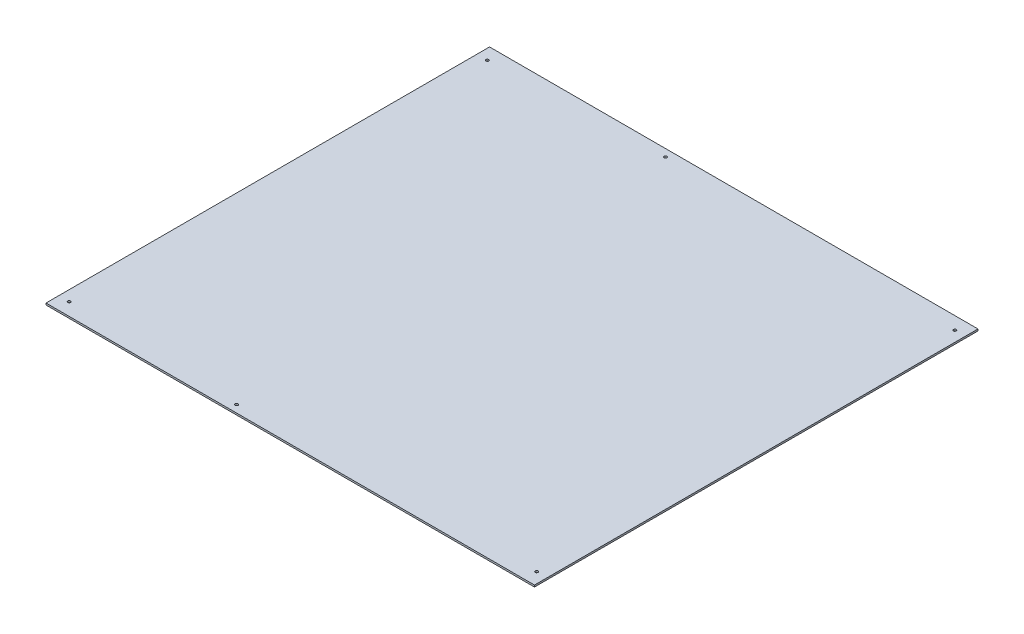
ISO-10303-21;
HEADER;
FILE_DESCRIPTION(('STEP AP214'),'2;1');
FILE_NAME('part.step','',(''),(''),'','','');
FILE_SCHEMA(('AUTOMOTIVE_DESIGN { 1 0 10303 214 1 1 1 1 }'));
ENDSEC;
DATA;
#1=APPLICATION_CONTEXT('core data for automotive mechanical design processes');
#2=APPLICATION_PROTOCOL_DEFINITION('international standard','automotive_design',2000,#1);
#3=PRODUCT_CONTEXT('',#1,'mechanical');
#4=PRODUCT('Part','Part','',(#3));
#5=PRODUCT_RELATED_PRODUCT_CATEGORY('part','',(#4));
#6=PRODUCT_DEFINITION_FORMATION('','',#4);
#7=PRODUCT_DEFINITION_CONTEXT('part definition',#1,'design');
#8=PRODUCT_DEFINITION('design','',#6,#7);
#9=PRODUCT_DEFINITION_SHAPE('','',#8);
#10=(LENGTH_UNIT() NAMED_UNIT(*) SI_UNIT(.MILLI.,.METRE.));
#11=(NAMED_UNIT(*) PLANE_ANGLE_UNIT() SI_UNIT($,.RADIAN.));
#12=(NAMED_UNIT(*) SI_UNIT($,.STERADIAN.) SOLID_ANGLE_UNIT());
#13=UNCERTAINTY_MEASURE_WITH_UNIT(LENGTH_MEASURE(1.E-05),#10,'distance_accuracy_value','');
#14=(GEOMETRIC_REPRESENTATION_CONTEXT(3) GLOBAL_UNCERTAINTY_ASSIGNED_CONTEXT((#13)) GLOBAL_UNIT_ASSIGNED_CONTEXT((#10,
#11,#12)) REPRESENTATION_CONTEXT('',''));
#15=CARTESIAN_POINT('',(0.,0.,0.));
#16=DIRECTION('',(0.,0.,1.));
#17=DIRECTION('',(1.,0.,0.));
#18=AXIS2_PLACEMENT_3D('',#15,#16,#17);
#19=CARTESIAN_POINT('',(0.,2.,0.));
#20=DIRECTION('',(0.,-1.,0.));
#21=DIRECTION('',(0.,0.,-1.));
#22=AXIS2_PLACEMENT_3D('',#19,#20,#21);
#23=PLANE('',#22);
#24=CARTESIAN_POINT('',(206.75,2.,-491.));
#25=DIRECTION('',(0.,1.,0.));
#26=DIRECTION('',(0.,0.,1.));
#27=AXIS2_PLACEMENT_3D('',#24,#25,#26);
#28=CIRCLE('',#27,1.59999999999996);
#29=CARTESIAN_POINT('',(206.75,2.,-489.4));
#30=VERTEX_POINT('',#29);
#31=EDGE_CURVE('E154',#30,#30,#28,.T.);
#32=ORIENTED_EDGE('',*,*,#31,.F.);
#33=EDGE_LOOP('',(#32));
#34=FACE_BOUND('',#33,.T.);
#35=CARTESIAN_POINT('',(206.75,2.,-9.00000000000001));
#36=DIRECTION('',(0.,1.,0.));
#37=DIRECTION('',(0.,0.,1.));
#38=AXIS2_PLACEMENT_3D('',#35,#36,#37);
#39=CIRCLE('',#38,1.59999999999996);
#40=CARTESIAN_POINT('',(206.75,2.,-7.40000000000005));
#41=VERTEX_POINT('',#40);
#42=EDGE_CURVE('E155',#41,#41,#39,.T.);
#43=ORIENTED_EDGE('',*,*,#42,.F.);
#44=EDGE_LOOP('',(#43));
#45=FACE_BOUND('',#44,.T.);
#46=CARTESIAN_POINT('',(12.5,2.,-485.));
#47=DIRECTION('',(0.,1.,0.));
#48=DIRECTION('',(0.,0.,1.));
#49=AXIS2_PLACEMENT_3D('',#46,#47,#48);
#50=CIRCLE('',#49,1.55000000000003);
#51=CARTESIAN_POINT('',(12.5,2.,-483.45));
#52=VERTEX_POINT('',#51);
#53=EDGE_CURVE('E44',#52,#52,#50,.T.);
#54=ORIENTED_EDGE('',*,*,#53,.F.);
#55=EDGE_LOOP('',(#54));
#56=FACE_BOUND('',#55,.T.);
#57=CARTESIAN_POINT('',(538.,2.,-485.));
#58=DIRECTION('',(0.,1.,0.));
#59=DIRECTION('',(0.,0.,-1.));
#60=AXIS2_PLACEMENT_3D('',#57,#58,#59);
#61=CIRCLE('',#60,1.55);
#62=CARTESIAN_POINT('',(538.,2.,-486.55));
#63=VERTEX_POINT('',#62);
#64=EDGE_CURVE('E114',#63,#63,#61,.T.);
#65=ORIENTED_EDGE('',*,*,#64,.F.);
#66=EDGE_LOOP('',(#65));
#67=FACE_BOUND('',#66,.T.);
#68=CARTESIAN_POINT('',(538.,2.,-15.0000000000001));
#69=DIRECTION('',(0.,1.,0.));
#70=DIRECTION('',(0.,0.,1.));
#71=AXIS2_PLACEMENT_3D('',#68,#69,#70);
#72=CIRCLE('',#71,1.54999999999999);
#73=CARTESIAN_POINT('',(538.,2.,-13.4500000000001));
#74=VERTEX_POINT('',#73);
#75=EDGE_CURVE('E121',#74,#74,#72,.T.);
#76=ORIENTED_EDGE('',*,*,#75,.F.);
#77=EDGE_LOOP('',(#76));
#78=FACE_BOUND('',#77,.T.);
#79=CARTESIAN_POINT('',(12.5,2.,-15.));
#80=DIRECTION('',(0.,1.,0.));
#81=DIRECTION('',(0.,0.,-1.));
#82=AXIS2_PLACEMENT_3D('',#79,#80,#81);
#83=CIRCLE('',#82,1.55000000000002);
#84=CARTESIAN_POINT('',(12.5,2.,-16.55));
#85=VERTEX_POINT('',#84);
#86=EDGE_CURVE('E106',#85,#85,#83,.T.);
#87=ORIENTED_EDGE('',*,*,#86,.F.);
#88=EDGE_LOOP('',(#87));
#89=FACE_BOUND('',#88,.T.);
#90=DIRECTION('',(0.,0.,-1.));
#91=VECTOR('',#90,1.);
#92=CARTESIAN_POINT('',(549.75,2.,-0.750000000000034));
#93=LINE('',#92,#91);
#94=CARTESIAN_POINT('',(549.75,2.,-0.750000000000034));
#95=VERTEX_POINT('',#94);
#96=CARTESIAN_POINT('',(549.75,2.,-499.25));
#97=VERTEX_POINT('',#96);
#98=EDGE_CURVE('E79',#95,#97,#93,.T.);
#99=ORIENTED_EDGE('',*,*,#98,.T.);
#100=DIRECTION('',(-1.,0.,0.));
#101=VECTOR('',#100,1.);
#102=CARTESIAN_POINT('',(549.75,2.,-499.25));
#103=LINE('',#102,#101);
#104=CARTESIAN_POINT('',(0.75,2.,-499.25));
#105=VERTEX_POINT('',#104);
#106=EDGE_CURVE('E92',#97,#105,#103,.T.);
#107=ORIENTED_EDGE('',*,*,#106,.T.);
#108=DIRECTION('',(0.,0.,1.));
#109=VECTOR('',#108,1.);
#110=CARTESIAN_POINT('',(0.75,2.,-499.25));
#111=LINE('',#110,#109);
#112=CARTESIAN_POINT('',(0.750000000000061,2.,-0.75));
#113=VERTEX_POINT('',#112);
#114=EDGE_CURVE('E51',#105,#113,#111,.T.);
#115=ORIENTED_EDGE('',*,*,#114,.T.);
#116=DIRECTION('',(1.,0.,0.));
#117=VECTOR('',#116,1.);
#118=CARTESIAN_POINT('',(0.750000000000061,2.,-0.75));
#119=LINE('',#118,#117);
#120=EDGE_CURVE('E109',#113,#95,#119,.T.);
#121=ORIENTED_EDGE('',*,*,#120,.T.);
#122=EDGE_LOOP('',(#99,#107,#115,#121));
#123=FACE_BOUND('',#122,.T.);
#124=ADVANCED_FACE('F36',(#34,#45,#56,#67,#78,#89,#123),#23,.F.);
#125=CARTESIAN_POINT('',(0.,0.,0.));
#126=DIRECTION('',(0.,-1.,0.));
#127=DIRECTION('',(0.,0.,-1.));
#128=AXIS2_PLACEMENT_3D('',#125,#126,#127);
#129=PLANE('',#128);
#130=CARTESIAN_POINT('',(206.75,0.,-491.));
#131=DIRECTION('',(0.,-1.,0.));
#132=DIRECTION('',(0.,0.,-1.));
#133=AXIS2_PLACEMENT_3D('',#130,#131,#132);
#134=CIRCLE('',#133,1.59999999999996);
#135=CARTESIAN_POINT('',(206.75,0.,-492.6));
#136=VERTEX_POINT('',#135);
#137=EDGE_CURVE('E83',#136,#136,#134,.F.);
#138=ORIENTED_EDGE('',*,*,#137,.T.);
#139=EDGE_LOOP('',(#138));
#140=FACE_BOUND('',#139,.T.);
#141=CARTESIAN_POINT('',(206.75,0.,-9.00000000000001));
#142=DIRECTION('',(0.,-1.,0.));
#143=DIRECTION('',(0.,0.,-1.));
#144=AXIS2_PLACEMENT_3D('',#141,#142,#143);
#145=CIRCLE('',#144,1.59999999999996);
#146=CARTESIAN_POINT('',(206.75,0.,-10.6));
#147=VERTEX_POINT('',#146);
#148=EDGE_CURVE('E151',#147,#147,#145,.F.);
#149=ORIENTED_EDGE('',*,*,#148,.T.);
#150=EDGE_LOOP('',(#149));
#151=FACE_BOUND('',#150,.T.);
#152=CARTESIAN_POINT('',(12.5,0.,-485.));
#153=DIRECTION('',(0.,-1.,0.));
#154=DIRECTION('',(0.,0.,-1.));
#155=AXIS2_PLACEMENT_3D('',#152,#153,#154);
#156=CIRCLE('',#155,1.55000000000003);
#157=CARTESIAN_POINT('',(12.5,0.,-486.55));
#158=VERTEX_POINT('',#157);
#159=EDGE_CURVE('E11',#158,#158,#156,.F.);
#160=ORIENTED_EDGE('',*,*,#159,.T.);
#161=EDGE_LOOP('',(#160));
#162=FACE_BOUND('',#161,.T.);
#163=CARTESIAN_POINT('',(538.,0.,-485.));
#164=DIRECTION('',(0.,-1.,0.));
#165=DIRECTION('',(0.,0.,-1.));
#166=AXIS2_PLACEMENT_3D('',#163,#164,#165);
#167=CIRCLE('',#166,1.55);
#168=CARTESIAN_POINT('',(538.,0.,-486.55));
#169=VERTEX_POINT('',#168);
#170=EDGE_CURVE('E117',#169,#169,#167,.F.);
#171=ORIENTED_EDGE('',*,*,#170,.T.);
#172=EDGE_LOOP('',(#171));
#173=FACE_BOUND('',#172,.T.);
#174=CARTESIAN_POINT('',(538.,0.,-15.0000000000001));
#175=DIRECTION('',(0.,-1.,0.));
#176=DIRECTION('',(0.,0.,-1.));
#177=AXIS2_PLACEMENT_3D('',#174,#175,#176);
#178=CIRCLE('',#177,1.54999999999999);
#179=CARTESIAN_POINT('',(538.,0.,-16.5500000000001));
#180=VERTEX_POINT('',#179);
#181=EDGE_CURVE('E118',#180,#180,#178,.F.);
#182=ORIENTED_EDGE('',*,*,#181,.T.);
#183=EDGE_LOOP('',(#182));
#184=FACE_BOUND('',#183,.T.);
#185=CARTESIAN_POINT('',(12.5,0.,-15.));
#186=DIRECTION('',(0.,-1.,0.));
#187=DIRECTION('',(0.,0.,-1.));
#188=AXIS2_PLACEMENT_3D('',#185,#186,#187);
#189=CIRCLE('',#188,1.55000000000002);
#190=CARTESIAN_POINT('',(12.5,0.,-16.55));
#191=VERTEX_POINT('',#190);
#192=EDGE_CURVE('E124',#191,#191,#189,.F.);
#193=ORIENTED_EDGE('',*,*,#192,.T.);
#194=EDGE_LOOP('',(#193));
#195=FACE_BOUND('',#194,.T.);
#196=DIRECTION('',(-1.,0.,0.));
#197=VECTOR('',#196,1.);
#198=CARTESIAN_POINT('',(549.75,0.,-499.25));
#199=LINE('',#198,#197);
#200=CARTESIAN_POINT('',(549.75,0.,-499.25));
#201=VERTEX_POINT('',#200);
#202=CARTESIAN_POINT('',(0.750000000000028,0.,-499.25));
#203=VERTEX_POINT('',#202);
#204=EDGE_CURVE('E96',#201,#203,#199,.T.);
#205=ORIENTED_EDGE('',*,*,#204,.F.);
#206=DIRECTION('',(0.,0.,-1.));
#207=VECTOR('',#206,1.);
#208=CARTESIAN_POINT('',(549.75,0.,-0.750000000000034));
#209=LINE('',#208,#207);
#210=CARTESIAN_POINT('',(549.75,0.,-0.750000000000034));
#211=VERTEX_POINT('',#210);
#212=EDGE_CURVE('E59',#211,#201,#209,.T.);
#213=ORIENTED_EDGE('',*,*,#212,.F.);
#214=DIRECTION('',(1.,0.,0.));
#215=VECTOR('',#214,1.);
#216=CARTESIAN_POINT('',(0.750000000000061,0.,-0.75));
#217=LINE('',#216,#215);
#218=CARTESIAN_POINT('',(0.750000000000061,0.,-0.75));
#219=VERTEX_POINT('',#218);
#220=EDGE_CURVE('E86',#219,#211,#217,.T.);
#221=ORIENTED_EDGE('',*,*,#220,.F.);
#222=DIRECTION('',(0.,0.,1.));
#223=VECTOR('',#222,1.);
#224=CARTESIAN_POINT('',(0.75,0.,-499.25));
#225=LINE('',#224,#223);
#226=EDGE_CURVE('E101',#203,#219,#225,.T.);
#227=ORIENTED_EDGE('',*,*,#226,.F.);
#228=EDGE_LOOP('',(#205,#213,#221,#227));
#229=FACE_BOUND('',#228,.T.);
#230=ADVANCED_FACE('F38',(#140,#151,#162,#173,#184,#195,#229),#129,.T.);
#231=CARTESIAN_POINT('',(12.5,-4.38406204335671,-485.));
#232=DIRECTION('',(0.,1.,0.));
#233=DIRECTION('',(0.,0.,1.));
#234=AXIS2_PLACEMENT_3D('',#231,#232,#233);
#235=CYLINDRICAL_SURFACE('',#234,1.55000000000003);
#236=ORIENTED_EDGE('',*,*,#53,.T.);
#237=EDGE_LOOP('',(#236));
#238=FACE_BOUND('',#237,.T.);
#239=ORIENTED_EDGE('',*,*,#159,.F.);
#240=EDGE_LOOP('',(#239));
#241=FACE_BOUND('',#240,.T.);
#242=ADVANCED_FACE('F133',(#238,#241),#235,.F.);
#243=CARTESIAN_POINT('',(538.,-4.38406204335671,-485.));
#244=DIRECTION('',(0.,1.,0.));
#245=DIRECTION('',(0.,0.,1.));
#246=AXIS2_PLACEMENT_3D('',#243,#244,#245);
#247=CYLINDRICAL_SURFACE('',#246,1.55);
#248=ORIENTED_EDGE('',*,*,#64,.T.);
#249=EDGE_LOOP('',(#248));
#250=FACE_BOUND('',#249,.T.);
#251=ORIENTED_EDGE('',*,*,#170,.F.);
#252=EDGE_LOOP('',(#251));
#253=FACE_BOUND('',#252,.T.);
#254=ADVANCED_FACE('F196',(#250,#253),#247,.F.);
#255=CARTESIAN_POINT('',(538.,-4.38406204335671,-15.0000000000001));
#256=DIRECTION('',(0.,1.,0.));
#257=DIRECTION('',(0.,0.,1.));
#258=AXIS2_PLACEMENT_3D('',#255,#256,#257);
#259=CYLINDRICAL_SURFACE('',#258,1.54999999999999);
#260=ORIENTED_EDGE('',*,*,#75,.T.);
#261=EDGE_LOOP('',(#260));
#262=FACE_BOUND('',#261,.T.);
#263=ORIENTED_EDGE('',*,*,#181,.F.);
#264=EDGE_LOOP('',(#263));
#265=FACE_BOUND('',#264,.T.);
#266=ADVANCED_FACE('F188',(#262,#265),#259,.F.);
#267=CARTESIAN_POINT('',(12.5,-4.38406204335671,-15.));
#268=DIRECTION('',(0.,1.,0.));
#269=DIRECTION('',(0.,0.,1.));
#270=AXIS2_PLACEMENT_3D('',#267,#268,#269);
#271=CYLINDRICAL_SURFACE('',#270,1.55000000000002);
#272=ORIENTED_EDGE('',*,*,#86,.T.);
#273=EDGE_LOOP('',(#272));
#274=FACE_BOUND('',#273,.T.);
#275=ORIENTED_EDGE('',*,*,#192,.F.);
#276=EDGE_LOOP('',(#275));
#277=FACE_BOUND('',#276,.T.);
#278=ADVANCED_FACE('F186',(#274,#277),#271,.F.);
#279=CARTESIAN_POINT('',(549.75,-743.673483458971,-0.750000000000034));
#280=DIRECTION('',(1.,0.,0.));
#281=DIRECTION('',(0.,0.,-1.));
#282=AXIS2_PLACEMENT_3D('',#279,#280,#281);
#283=PLANE('',#282);
#284=ORIENTED_EDGE('',*,*,#212,.T.);
#285=DIRECTION('',(0.,1.,0.));
#286=VECTOR('',#285,1.);
#287=CARTESIAN_POINT('',(549.75,-743.673483458971,-499.25));
#288=LINE('',#287,#286);
#289=EDGE_CURVE('E112',#201,#97,#288,.T.);
#290=ORIENTED_EDGE('',*,*,#289,.T.);
#291=ORIENTED_EDGE('',*,*,#98,.F.);
#292=DIRECTION('',(0.,1.,0.));
#293=VECTOR('',#292,1.);
#294=CARTESIAN_POINT('',(549.75,-743.673483458971,-0.750000000000034));
#295=LINE('',#294,#293);
#296=EDGE_CURVE('E75',#211,#95,#295,.T.);
#297=ORIENTED_EDGE('',*,*,#296,.F.);
#298=EDGE_LOOP('',(#284,#290,#291,#297));
#299=FACE_BOUND('',#298,.T.);
#300=ADVANCED_FACE('F77',(#299),#283,.T.);
#301=CARTESIAN_POINT('',(0.750000000000061,-743.673483458971,-0.75));
#302=DIRECTION('',(0.,0.,1.));
#303=DIRECTION('',(1.,0.,0.));
#304=AXIS2_PLACEMENT_3D('',#301,#302,#303);
#305=PLANE('',#304);
#306=ORIENTED_EDGE('',*,*,#220,.T.);
#307=ORIENTED_EDGE('',*,*,#296,.T.);
#308=ORIENTED_EDGE('',*,*,#120,.F.);
#309=DIRECTION('',(0.,1.,0.));
#310=VECTOR('',#309,1.);
#311=CARTESIAN_POINT('',(0.750000000000061,-743.673483458971,-0.75));
#312=LINE('',#311,#310);
#313=EDGE_CURVE('E88',#219,#113,#312,.T.);
#314=ORIENTED_EDGE('',*,*,#313,.F.);
#315=EDGE_LOOP('',(#306,#307,#308,#314));
#316=FACE_BOUND('',#315,.T.);
#317=ADVANCED_FACE('F87',(#316),#305,.T.);
#318=CARTESIAN_POINT('',(0.75,-743.673483458971,-499.25));
#319=DIRECTION('',(-1.,0.,0.));
#320=DIRECTION('',(0.,0.,1.));
#321=AXIS2_PLACEMENT_3D('',#318,#319,#320);
#322=PLANE('',#321);
#323=ORIENTED_EDGE('',*,*,#226,.T.);
#324=ORIENTED_EDGE('',*,*,#313,.T.);
#325=ORIENTED_EDGE('',*,*,#114,.F.);
#326=DIRECTION('',(0.,1.,0.));
#327=VECTOR('',#326,1.);
#328=CARTESIAN_POINT('',(0.75,-743.673483458971,-499.25));
#329=LINE('',#328,#327);
#330=EDGE_CURVE('E110',#203,#105,#329,.T.);
#331=ORIENTED_EDGE('',*,*,#330,.F.);
#332=EDGE_LOOP('',(#323,#324,#325,#331));
#333=FACE_BOUND('',#332,.T.);
#334=ADVANCED_FACE('F212',(#333),#322,.T.);
#335=CARTESIAN_POINT('',(549.75,-743.673483458971,-499.25));
#336=DIRECTION('',(0.,0.,-1.));
#337=DIRECTION('',(-1.,0.,0.));
#338=AXIS2_PLACEMENT_3D('',#335,#336,#337);
#339=PLANE('',#338);
#340=ORIENTED_EDGE('',*,*,#204,.T.);
#341=ORIENTED_EDGE('',*,*,#330,.T.);
#342=ORIENTED_EDGE('',*,*,#106,.F.);
#343=ORIENTED_EDGE('',*,*,#289,.F.);
#344=EDGE_LOOP('',(#340,#341,#342,#343));
#345=FACE_BOUND('',#344,.T.);
#346=ADVANCED_FACE('F171',(#345),#339,.T.);
#347=CARTESIAN_POINT('',(206.75,-4.5254833995938,-9.00000000000001));
#348=DIRECTION('',(0.,1.,0.));
#349=DIRECTION('',(0.,0.,1.));
#350=AXIS2_PLACEMENT_3D('',#347,#348,#349);
#351=CYLINDRICAL_SURFACE('',#350,1.59999999999996);
#352=ORIENTED_EDGE('',*,*,#42,.T.);
#353=EDGE_LOOP('',(#352));
#354=FACE_BOUND('',#353,.T.);
#355=ORIENTED_EDGE('',*,*,#148,.F.);
#356=EDGE_LOOP('',(#355));
#357=FACE_BOUND('',#356,.T.);
#358=ADVANCED_FACE('F168',(#354,#357),#351,.F.);
#359=CARTESIAN_POINT('',(206.75,-4.5254833995938,-491.));
#360=DIRECTION('',(0.,1.,0.));
#361=DIRECTION('',(0.,0.,1.));
#362=AXIS2_PLACEMENT_3D('',#359,#360,#361);
#363=CYLINDRICAL_SURFACE('',#362,1.59999999999996);
#364=ORIENTED_EDGE('',*,*,#31,.T.);
#365=EDGE_LOOP('',(#364));
#366=FACE_BOUND('',#365,.T.);
#367=ORIENTED_EDGE('',*,*,#137,.F.);
#368=EDGE_LOOP('',(#367));
#369=FACE_BOUND('',#368,.T.);
#370=ADVANCED_FACE('F163',(#366,#369),#363,.F.);
#371=CLOSED_SHELL('',(#124,#230,#242,#254,#266,#278,#300,#317,#334,#346,#358,#370));
#372=MANIFOLD_SOLID_BREP('B2',#371);
#373=ADVANCED_BREP_SHAPE_REPRESENTATION('',(#18,#372),#14);
#374=SHAPE_DEFINITION_REPRESENTATION(#9,#373);
ENDSEC;
END-ISO-10303-21;
